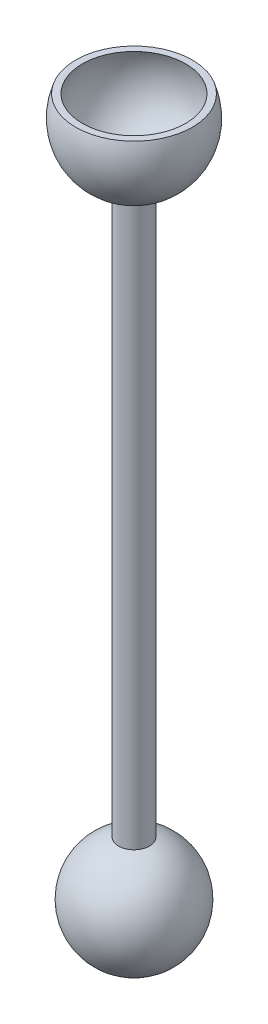
ISO-10303-21;
HEADER;
FILE_DESCRIPTION(('STEP AP214'),'2;1');
FILE_NAME('part.step','',(''),(''),'','','');
FILE_SCHEMA(('AUTOMOTIVE_DESIGN { 1 0 10303 214 1 1 1 1 }'));
ENDSEC;
DATA;
#1=APPLICATION_CONTEXT('core data for automotive mechanical design processes');
#2=APPLICATION_PROTOCOL_DEFINITION('international standard','automotive_design',2000,#1);
#3=PRODUCT_CONTEXT('',#1,'mechanical');
#4=PRODUCT('Part','Part','',(#3));
#5=PRODUCT_RELATED_PRODUCT_CATEGORY('part','',(#4));
#6=PRODUCT_DEFINITION_FORMATION('','',#4);
#7=PRODUCT_DEFINITION_CONTEXT('part definition',#1,'design');
#8=PRODUCT_DEFINITION('design','',#6,#7);
#9=PRODUCT_DEFINITION_SHAPE('','',#8);
#10=(LENGTH_UNIT() NAMED_UNIT(*) SI_UNIT(.MILLI.,.METRE.));
#11=(NAMED_UNIT(*) PLANE_ANGLE_UNIT() SI_UNIT($,.RADIAN.));
#12=(NAMED_UNIT(*) SI_UNIT($,.STERADIAN.) SOLID_ANGLE_UNIT());
#13=UNCERTAINTY_MEASURE_WITH_UNIT(LENGTH_MEASURE(1.E-05),#10,'distance_accuracy_value','');
#14=(GEOMETRIC_REPRESENTATION_CONTEXT(3) GLOBAL_UNCERTAINTY_ASSIGNED_CONTEXT((#13)) GLOBAL_UNIT_ASSIGNED_CONTEXT((#10,
#11,#12)) REPRESENTATION_CONTEXT('',''));
#15=CARTESIAN_POINT('',(0.,0.,0.));
#16=DIRECTION('',(0.,0.,1.));
#17=DIRECTION('',(1.,0.,0.));
#18=AXIS2_PLACEMENT_3D('',#15,#16,#17);
#19=CARTESIAN_POINT('',(0.,109.,0.));
#20=DIRECTION('',(0.,-1.,0.));
#21=DIRECTION('',(0.,0.,1.));
#22=AXIS2_PLACEMENT_3D('',#19,#20,#21);
#23=SPHERICAL_SURFACE('',#22,9.99999999999999);
#24=CARTESIAN_POINT('',(0.,99.3175416344815,0.));
#25=DIRECTION('',(0.,1.,0.));
#26=DIRECTION('',(0.,0.,1.));
#27=AXIS2_PLACEMENT_3D('',#24,#25,#26);
#28=CIRCLE('',#27,2.5);
#29=CARTESIAN_POINT('',(0.,99.3175416344815,2.49999999999998));
#30=VERTEX_POINT('',#29);
#31=EDGE_CURVE('E49',#30,#30,#28,.F.);
#32=CARTESIAN_POINT('',(0.,112.420895881999,0.));
#33=DIRECTION('',(0.,1.,0.));
#34=DIRECTION('',(0.,0.,1.));
#35=AXIS2_PLACEMENT_3D('',#32,#33,#34);
#36=CIRCLE('',#35,9.39667342012705);
#37=CARTESIAN_POINT('',(0.,112.420895881999,9.39667342012705));
#38=VERTEX_POINT('',#37);
#39=EDGE_CURVE('E45',#38,#38,#36,.F.);
#40=CARTESIAN_POINT('',(0.,99.3175416344815,2.49999999999998));
#41=CARTESIAN_POINT('',(0.,99.3609555458539,2.66815897402842));
#42=CARTESIAN_POINT('',(0.,99.4087583891738,2.83518431981211));
#43=CARTESIAN_POINT('',(0.,99.5129937325344,3.16652026259253));
#44=CARTESIAN_POINT('',(0.,99.5694262325751,3.33083085958925));
#45=CARTESIAN_POINT('',(0.,99.6907726822029,3.65628981249818));
#46=CARTESIAN_POINT('',(0.,99.7556866317901,3.8174381684104));
#47=CARTESIAN_POINT('',(0.,99.8938184793147,4.13613570329221));
#48=CARTESIAN_POINT('',(0.,99.9670363772521,4.29368488226181));
#49=CARTESIAN_POINT('',(0.,100.12157776508,4.60475636650449));
#50=CARTESIAN_POINT('',(0.,100.202901254971,4.75827867177757));
#51=CARTESIAN_POINT('',(0.,100.373433021348,5.06087978245922));
#52=CARTESIAN_POINT('',(0.,100.462641297834,5.20995858786779));
#53=CARTESIAN_POINT('',(0.,100.648700553636,5.50326809423303));
#54=CARTESIAN_POINT('',(0.,100.745551532952,5.6474987951897));
#55=CARTESIAN_POINT('',(0.,100.946633336176,5.93072065588786));
#56=CARTESIAN_POINT('',(0.,101.050864160083,6.06971181562934));
#57=CARTESIAN_POINT('',(0.,101.266422774183,6.34207737440538));
#58=CARTESIAN_POINT('',(0.,101.377750564376,6.47545177343994));
#59=CARTESIAN_POINT('',(0.,101.607200969409,6.73622183580459));
#60=CARTESIAN_POINT('',(0.,101.72532358425,6.86361749913469));
#61=CARTESIAN_POINT('',(0.,101.968043056564,7.11208434105285));
#62=CARTESIAN_POINT('',(0.,102.092639914036,7.23315551964091));
#63=CARTESIAN_POINT('',(0.,102.347969718477,7.46864480760076));
#64=CARTESIAN_POINT('',(0.,102.478702665445,7.58306291697255));
#65=CARTESIAN_POINT('',(0.,102.745949842579,7.8049355382934));
#66=CARTESIAN_POINT('',(0.,102.882464072744,7.91239005024247));
#67=CARTESIAN_POINT('',(0.,103.160903319683,8.1200438475637));
#68=CARTESIAN_POINT('',(0.,103.302828336458,8.22024313293586));
#69=CARTESIAN_POINT('',(0.,103.59170397528,8.41311453847161));
#70=CARTESIAN_POINT('',(0.,103.738654597327,8.5057866586352));
#71=CARTESIAN_POINT('',(0.,104.037182625974,8.68335222368134));
#72=CARTESIAN_POINT('',(0.,104.188760032574,8.7682456685639));
#73=CARTESIAN_POINT('',(0.,104.496130252618,8.93002348412707));
#74=CARTESIAN_POINT('',(0.,104.651923066062,9.0069078548077));
#75=CARTESIAN_POINT('',(0.,104.967301281562,9.15245885949543));
#76=CARTESIAN_POINT('',(0.,105.12688668362,9.22112549350253));
#77=CARTESIAN_POINT('',(0.,105.449416965117,9.3500546651259));
#78=CARTESIAN_POINT('',(0.,105.612361844557,9.41031720274217));
#79=CARTESIAN_POINT('',(0.,105.941168852041,9.52227463039808));
#80=CARTESIAN_POINT('',(0.,106.107030980086,9.57396952043771));
#81=CARTESIAN_POINT('',(0.,106.441222338653,9.66865135415626));
#82=CARTESIAN_POINT('',(0.,106.609551569176,9.71163829783517));
#83=CARTESIAN_POINT('',(0.,106.948220290917,9.78878757323288));
#84=CARTESIAN_POINT('',(0.,107.118559782134,9.82294990495168));
#85=CARTESIAN_POINT('',(0.,107.460786727663,9.88235724058553));
#86=CARTESIAN_POINT('',(0.,107.632674181974,9.90760224450059));
#87=CARTESIAN_POINT('',(0.,107.977530555003,9.94910641027977));
#88=CARTESIAN_POINT('',(0.,108.150499473721,9.96536557214389));
#89=CARTESIAN_POINT('',(0.,108.497049341615,9.98885392632561));
#90=CARTESIAN_POINT('',(0.,108.670630290792,9.99608311864321));
#91=CARTESIAN_POINT('',(0.,109.017933125332,10.0014919157009));
#92=CARTESIAN_POINT('',(0.,109.191655010695,9.99967152044101));
#93=CARTESIAN_POINT('',(0.,109.538768238177,9.98698607600333));
#94=CARTESIAN_POINT('',(0.,109.712159580297,9.97612102682555));
#95=CARTESIAN_POINT('',(0.,110.058141148875,9.9453757876282));
#96=CARTESIAN_POINT('',(0.,110.230731375334,9.92549559760861));
#97=CARTESIAN_POINT('',(0.,110.574642277342,9.87677393567648));
#98=CARTESIAN_POINT('',(0.,110.74596295289,9.84793246376393));
#99=CARTESIAN_POINT('',(0.,111.086869901605,9.78136686936319));
#100=CARTESIAN_POINT('',(0.,111.256456174772,9.74364274687501));
#101=CARTESIAN_POINT('',(0.,111.59343365844,9.65941290438012));
#102=CARTESIAN_POINT('',(0.,111.760824868941,9.61290718437341));
#103=CARTESIAN_POINT('',(0.,112.092959449873,9.51124532361529));
#104=CARTESIAN_POINT('',(0.,112.257702820304,9.45608918286388));
#105=CARTESIAN_POINT('',(0.,112.420895881999,9.39667342012705));
#106=B_SPLINE_CURVE_WITH_KNOTS('',3,(#40,#41,#42,#43,#44,#45,#46,#47,#48,#49,#50,#51,#52,#53,
#54,#55,#56,#57,#58,#59,#60,#61,#62,#63,#64,#65,#66,#67,#68,#69,#70,#71,#72,#73,#74,#75,#76,#77,
#78,#79,#80,#81,#82,#83,#84,#85,#86,#87,#88,#89,#90,#91,#92,#93,#94,#95,#96,#97,#98,#99,#100,
#101,#102,#103,#104,#105),.UNSPECIFIED.,.F.,.F.,(4,2,2,2,2,2,2,2,2,2,2,2,2,2,2,2,2,2,2,2,2,2,2,
2,2,2,2,2,2,2,2,2,4),(0.,0.520958515993564,1.04191703198713,1.5628755479807,2.08383406397427,
2.60479257996783,3.1257510959614,3.64670961195497,4.16766812794854,4.6886266439421,
5.20958515993567,5.73054367592924,6.2515021919228,6.77246070791636,7.29341922390993,
7.81437773990351,8.33533625589707,8.85629477189063,9.3772532878842,9.89821180387777,
10.4191703198713,10.9401288358649,11.4610873518585,11.982045867852,12.5030043838456,
13.0239628998392,13.5449214158327,14.0658799318263,14.5868384478199,15.1077969638134,
15.628755479807,16.1497139958006,16.6706725117941),.UNSPECIFIED.);
#107=EDGE_CURVE('BSEAM41',#30,#38,#106,.T.);
#108=ORIENTED_EDGE('',*,*,#31,.F.);
#109=ORIENTED_EDGE('',*,*,#39,.T.);
#110=ORIENTED_EDGE('',*,*,#107,.T.);
#111=ORIENTED_EDGE('',*,*,#107,.F.);
#112=EDGE_LOOP('',(#108,#110,#109,#111));
#113=FACE_BOUND('',#112,.T.);
#114=ADVANCED_FACE('F41',(#113),#23,.T.);
#115=CARTESIAN_POINT('',(0.,109.,0.));
#116=DIRECTION('',(0.,-1.,0.));
#117=DIRECTION('',(0.,0.,-1.));
#118=AXIS2_PLACEMENT_3D('',#115,#116,#117);
#119=CYLINDRICAL_SURFACE('',#118,2.5);
#120=ORIENTED_EDGE('',*,*,#31,.T.);
#121=EDGE_LOOP('',(#120));
#122=FACE_BOUND('',#121,.T.);
#123=CARTESIAN_POINT('',(0.,8.64580823289529,0.));
#124=DIRECTION('',(0.,-1.,0.));
#125=DIRECTION('',(0.,0.,-1.));
#126=AXIS2_PLACEMENT_3D('',#123,#124,#125);
#127=CIRCLE('',#126,2.5);
#128=CARTESIAN_POINT('',(0.,8.64580823289529,-2.5));
#129=VERTEX_POINT('',#128);
#130=EDGE_CURVE('E10',#129,#129,#127,.T.);
#131=ORIENTED_EDGE('',*,*,#130,.F.);
#132=EDGE_LOOP('',(#131));
#133=FACE_BOUND('',#132,.T.);
#134=ADVANCED_FACE('F74',(#122,#133),#119,.T.);
#135=CARTESIAN_POINT('',(0.,0.,0.));
#136=DIRECTION('',(0.,-1.,0.));
#137=DIRECTION('',(-1.,0.,0.));
#138=AXIS2_PLACEMENT_3D('',#135,#136,#137);
#139=SPHERICAL_SURFACE('',#138,9.);
#140=ORIENTED_EDGE('',*,*,#130,.T.);
#141=EDGE_LOOP('',(#140));
#142=FACE_BOUND('',#141,.T.);
#143=ADVANCED_FACE('F43',(#142),#139,.T.);
#144=CARTESIAN_POINT('',(10.,112.420895881999,9.99999999999999));
#145=DIRECTION('',(0.,1.,0.));
#146=DIRECTION('',(0.,0.,1.));
#147=AXIS2_PLACEMENT_3D('',#144,#145,#146);
#148=PLANE('',#147);
#149=CARTESIAN_POINT('',(0.,112.420895881999,0.));
#150=DIRECTION('',(0.,1.,0.));
#151=DIRECTION('',(0.,0.,1.));
#152=AXIS2_PLACEMENT_3D('',#149,#150,#151);
#153=CIRCLE('',#152,8.32451027775942);
#154=CARTESIAN_POINT('',(0.,112.420895881999,8.32451027775942));
#155=VERTEX_POINT('',#154);
#156=EDGE_CURVE('E55',#155,#155,#153,.F.);
#157=ORIENTED_EDGE('',*,*,#156,.T.);
#158=EDGE_LOOP('',(#157));
#159=FACE_BOUND('',#158,.T.);
#160=ORIENTED_EDGE('',*,*,#39,.F.);
#161=EDGE_LOOP('',(#160));
#162=FACE_BOUND('',#161,.T.);
#163=ADVANCED_FACE('F63',(#159,#162),#148,.T.);
#164=CARTESIAN_POINT('',(0.,109.,0.));
#165=DIRECTION('',(0.,-1.,0.));
#166=DIRECTION('',(0.,0.,1.));
#167=AXIS2_PLACEMENT_3D('',#164,#165,#166);
#168=SPHERICAL_SURFACE('',#167,8.99999999999999);
#169=ORIENTED_EDGE('',*,*,#156,.F.);
#170=EDGE_LOOP('',(#169));
#171=FACE_BOUND('',#170,.T.);
#172=ADVANCED_FACE('F65',(#171),#168,.F.);
#173=CLOSED_SHELL('',(#114,#134,#143,#163,#172));
#174=MANIFOLD_SOLID_BREP('B2',#173);
#175=ADVANCED_BREP_SHAPE_REPRESENTATION('',(#18,#174),#14);
#176=SHAPE_DEFINITION_REPRESENTATION(#9,#175);
ENDSEC;
END-ISO-10303-21;
